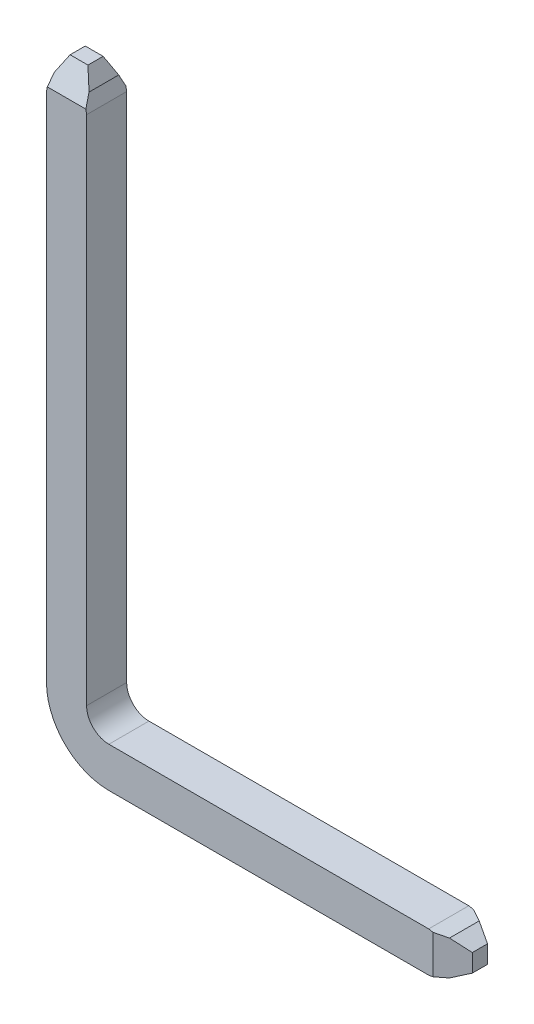
ISO-10303-21;
HEADER;
FILE_DESCRIPTION(('STEP AP214'),'2;1');
FILE_NAME('part.step','',(''),(''),'','','');
FILE_SCHEMA(('AUTOMOTIVE_DESIGN { 1 0 10303 214 1 1 1 1 }'));
ENDSEC;
DATA;
#1=APPLICATION_CONTEXT('core data for automotive mechanical design processes');
#2=APPLICATION_PROTOCOL_DEFINITION('international standard','automotive_design',2000,#1);
#3=PRODUCT_CONTEXT('',#1,'mechanical');
#4=PRODUCT('Part','Part','',(#3));
#5=PRODUCT_RELATED_PRODUCT_CATEGORY('part','',(#4));
#6=PRODUCT_DEFINITION_FORMATION('','',#4);
#7=PRODUCT_DEFINITION_CONTEXT('part definition',#1,'design');
#8=PRODUCT_DEFINITION('design','',#6,#7);
#9=PRODUCT_DEFINITION_SHAPE('','',#8);
#10=(LENGTH_UNIT() NAMED_UNIT(*) SI_UNIT(.MILLI.,.METRE.));
#11=(NAMED_UNIT(*) PLANE_ANGLE_UNIT() SI_UNIT($,.RADIAN.));
#12=(NAMED_UNIT(*) SI_UNIT($,.STERADIAN.) SOLID_ANGLE_UNIT());
#13=UNCERTAINTY_MEASURE_WITH_UNIT(LENGTH_MEASURE(1.E-05),#10,'distance_accuracy_value','');
#14=(GEOMETRIC_REPRESENTATION_CONTEXT(3) GLOBAL_UNCERTAINTY_ASSIGNED_CONTEXT((#13)) GLOBAL_UNIT_ASSIGNED_CONTEXT((#10,
#11,#12)) REPRESENTATION_CONTEXT('',''));
#15=CARTESIAN_POINT('',(0.,0.,0.));
#16=DIRECTION('',(0.,0.,1.));
#17=DIRECTION('',(1.,0.,0.));
#18=AXIS2_PLACEMENT_3D('',#15,#16,#17);
#19=CARTESIAN_POINT('',(11.2141,20.716822708758,0.5715));
#20=DIRECTION('',(-1.,0.,0.));
#21=DIRECTION('',(0.,0.,1.));
#22=AXIS2_PLACEMENT_3D('',#19,#20,#21);
#23=PLANE('',#22);
#24=DIRECTION('',(0.,1.,0.));
#25=VECTOR('',#24,1.);
#26=CARTESIAN_POINT('',(11.2141,16.6878,0.216173564485889));
#27=LINE('',#26,#25);
#28=CARTESIAN_POINT('',(11.2141,0.254384160478348,0.216173564485889));
#29=VERTEX_POINT('',#28);
#30=CARTESIAN_POINT('',(11.2141,-0.254384160478346,0.216173564485889));
#31=VERTEX_POINT('',#30);
#32=EDGE_CURVE('E280',#29,#31,#27,.F.);
#33=ORIENTED_EDGE('',*,*,#32,.T.);
#34=DIRECTION('',(0.,0.,1.));
#35=VECTOR('',#34,1.);
#36=CARTESIAN_POINT('',(11.2141,-0.254384160478346,-0.5715));
#37=LINE('',#36,#35);
#38=CARTESIAN_POINT('',(11.2141,-0.254384160478346,-0.216173564485888));
#39=VERTEX_POINT('',#38);
#40=EDGE_CURVE('E235',#31,#39,#37,.F.);
#41=ORIENTED_EDGE('',*,*,#40,.T.);
#42=DIRECTION('',(0.,1.,0.));
#43=VECTOR('',#42,1.);
#44=CARTESIAN_POINT('',(11.2141,16.6878,-0.216173564485889));
#45=LINE('',#44,#43);
#46=CARTESIAN_POINT('',(11.2141,0.254384160478346,-0.216173564485889));
#47=VERTEX_POINT('',#46);
#48=EDGE_CURVE('E223',#39,#47,#45,.T.);
#49=ORIENTED_EDGE('',*,*,#48,.T.);
#50=DIRECTION('',(0.,0.,1.));
#51=VECTOR('',#50,1.);
#52=CARTESIAN_POINT('',(11.2141,0.254384160478348,-0.5715));
#53=LINE('',#52,#51);
#54=EDGE_CURVE('E234',#47,#29,#53,.T.);
#55=ORIENTED_EDGE('',*,*,#54,.T.);
#56=EDGE_LOOP('',(#33,#41,#49,#55));
#57=FACE_BOUND('',#56,.T.);
#58=ADVANCED_FACE('F16',(#57),#23,.F.);
#59=CARTESIAN_POINT('',(10.7696,-0.493122657075091,-0.5715));
#60=DIRECTION('',(-0.473165915539229,0.880973334654303,0.));
#61=DIRECTION('',(-0.880973334654303,-0.473165915539229,0.));
#62=AXIS2_PLACEMENT_3D('',#59,#60,#61);
#63=PLANE('',#62);
#64=DIRECTION('',(-0.814891923823506,-0.437673954516203,0.379990344647562));
#65=VECTOR('',#64,1.);
#66=CARTESIAN_POINT('',(11.2141,-0.254384160478346,0.216173564485888));
#67=LINE('',#66,#65);
#68=CARTESIAN_POINT('',(10.7696,-0.493122657075091,0.423447318535787));
#69=VERTEX_POINT('',#68);
#70=EDGE_CURVE('E258',#31,#69,#67,.T.);
#71=ORIENTED_EDGE('',*,*,#70,.T.);
#72=DIRECTION('',(0.,0.,1.));
#73=VECTOR('',#72,1.);
#74=CARTESIAN_POINT('',(10.7696,-0.493122657075091,-0.5715));
#75=LINE('',#74,#73);
#76=CARTESIAN_POINT('',(10.7696,-0.493122657075091,-0.423447318535787));
#77=VERTEX_POINT('',#76);
#78=EDGE_CURVE('E197',#69,#77,#75,.F.);
#79=ORIENTED_EDGE('',*,*,#78,.T.);
#80=DIRECTION('',(0.814891923823506,0.437673954516204,0.379990344647562));
#81=VECTOR('',#80,1.);
#82=CARTESIAN_POINT('',(10.7696,-0.493122657075091,-0.423447318535787));
#83=LINE('',#82,#81);
#84=EDGE_CURVE('E255',#77,#39,#83,.T.);
#85=ORIENTED_EDGE('',*,*,#84,.T.);
#86=ORIENTED_EDGE('',*,*,#40,.F.);
#87=EDGE_LOOP('',(#71,#79,#85,#86));
#88=FACE_BOUND('',#87,.T.);
#89=ADVANCED_FACE('F546',(#88),#63,.F.);
#90=CARTESIAN_POINT('',(10.7696,0.493122657075091,-0.5715));
#91=DIRECTION('',(-0.473165915539229,-0.880973334654303,0.));
#92=DIRECTION('',(0.880973334654303,-0.473165915539229,0.));
#93=AXIS2_PLACEMENT_3D('',#90,#91,#92);
#94=PLANE('',#93);
#95=DIRECTION('',(0.814891923823508,-0.437673954516199,-0.379990344647563));
#96=VECTOR('',#95,1.);
#97=CARTESIAN_POINT('',(10.7696,0.493122657075091,0.423447318535787));
#98=LINE('',#97,#96);
#99=CARTESIAN_POINT('',(10.7696,0.493122657075091,0.423447318535787));
#100=VERTEX_POINT('',#99);
#101=EDGE_CURVE('E248',#100,#29,#98,.T.);
#102=ORIENTED_EDGE('',*,*,#101,.T.);
#103=ORIENTED_EDGE('',*,*,#54,.F.);
#104=DIRECTION('',(-0.814891923823506,0.437673954516204,-0.379990344647562));
#105=VECTOR('',#104,1.);
#106=CARTESIAN_POINT('',(11.2141,0.254384160478346,-0.216173564485889));
#107=LINE('',#106,#105);
#108=CARTESIAN_POINT('',(10.7696,0.493122657075091,-0.423447318535787));
#109=VERTEX_POINT('',#108);
#110=EDGE_CURVE('E210',#47,#109,#107,.T.);
#111=ORIENTED_EDGE('',*,*,#110,.T.);
#112=DIRECTION('',(0.,0.,1.));
#113=VECTOR('',#112,1.);
#114=CARTESIAN_POINT('',(10.7696,0.493122657075091,-0.5715));
#115=LINE('',#114,#113);
#116=EDGE_CURVE('E219',#109,#100,#115,.T.);
#117=ORIENTED_EDGE('',*,*,#116,.T.);
#118=EDGE_LOOP('',(#102,#103,#111,#117));
#119=FACE_BOUND('',#118,.T.);
#120=ADVANCED_FACE('F538',(#119),#94,.F.);
#121=CARTESIAN_POINT('',(11.2141,16.6878,0.216173564485889));
#122=DIRECTION('',(-0.422618261740701,0.,-0.906307787036649));
#123=DIRECTION('',(-0.906307787036649,0.,0.422618261740701));
#124=AXIS2_PLACEMENT_3D('',#121,#122,#123);
#125=PLANE('',#124);
#126=ORIENTED_EDGE('',*,*,#32,.F.);
#127=ORIENTED_EDGE('',*,*,#101,.F.);
#128=DIRECTION('',(-0.894952131932453,0.157804207302247,0.417323032802248));
#129=VECTOR('',#128,1.);
#130=CARTESIAN_POINT('',(10.7696,0.493122657075091,0.423447318535787));
#131=LINE('',#130,#129);
#132=CARTESIAN_POINT('',(10.4521,0.549106473450026,0.5715));
#133=VERTEX_POINT('',#132);
#134=EDGE_CURVE('E214',#100,#133,#131,.T.);
#135=ORIENTED_EDGE('',*,*,#134,.T.);
#136=DIRECTION('',(0.,1.,0.));
#137=VECTOR('',#136,1.);
#138=CARTESIAN_POINT('',(10.4521,16.6878,0.5715));
#139=LINE('',#138,#137);
#140=CARTESIAN_POINT('',(10.4521,-0.549106473450026,0.5715));
#141=VERTEX_POINT('',#140);
#142=EDGE_CURVE('E245',#141,#133,#139,.T.);
#143=ORIENTED_EDGE('',*,*,#142,.F.);
#144=DIRECTION('',(0.894952131932454,0.157804207302247,-0.417323032802247));
#145=VECTOR('',#144,1.);
#146=CARTESIAN_POINT('',(10.4521,-0.549106473450026,0.5715));
#147=LINE('',#146,#145);
#148=EDGE_CURVE('E239',#141,#69,#147,.T.);
#149=ORIENTED_EDGE('',*,*,#148,.T.);
#150=ORIENTED_EDGE('',*,*,#70,.F.);
#151=EDGE_LOOP('',(#126,#127,#135,#143,#149,#150));
#152=FACE_BOUND('',#151,.T.);
#153=ADVANCED_FACE('F531',(#152),#125,.F.);
#154=CARTESIAN_POINT('',(11.2141,16.6878,-0.216173564485889));
#155=DIRECTION('',(-0.422618261740701,0.,0.906307787036649));
#156=DIRECTION('',(0.906307787036649,0.,0.422618261740701));
#157=AXIS2_PLACEMENT_3D('',#154,#155,#156);
#158=PLANE('',#157);
#159=DIRECTION('',(0.894952131932453,-0.157804207302247,0.417323032802248));
#160=VECTOR('',#159,1.);
#161=CARTESIAN_POINT('',(10.4521,0.549106473450026,-0.5715));
#162=LINE('',#161,#160);
#163=CARTESIAN_POINT('',(10.4521,0.549106473450026,-0.5715));
#164=VERTEX_POINT('',#163);
#165=EDGE_CURVE('E191',#164,#109,#162,.T.);
#166=ORIENTED_EDGE('',*,*,#165,.T.);
#167=ORIENTED_EDGE('',*,*,#110,.F.);
#168=ORIENTED_EDGE('',*,*,#48,.F.);
#169=ORIENTED_EDGE('',*,*,#84,.F.);
#170=DIRECTION('',(-0.894952131932453,-0.157804207302247,-0.417323032802249));
#171=VECTOR('',#170,1.);
#172=CARTESIAN_POINT('',(10.7696,-0.493122657075091,-0.423447318535787));
#173=LINE('',#172,#171);
#174=CARTESIAN_POINT('',(10.4521,-0.549106473450029,-0.5715));
#175=VERTEX_POINT('',#174);
#176=EDGE_CURVE('E207',#77,#175,#173,.T.);
#177=ORIENTED_EDGE('',*,*,#176,.T.);
#178=DIRECTION('',(0.,1.,0.));
#179=VECTOR('',#178,1.);
#180=CARTESIAN_POINT('',(10.4521,20.716822708758,-0.5715));
#181=LINE('',#180,#179);
#182=EDGE_CURVE('E204',#164,#175,#181,.F.);
#183=ORIENTED_EDGE('',*,*,#182,.F.);
#184=EDGE_LOOP('',(#166,#167,#168,#169,#177,#183));
#185=FACE_BOUND('',#184,.T.);
#186=ADVANCED_FACE('F377',(#185),#158,.F.);
#187=CARTESIAN_POINT('',(10.3251,-0.5715,-0.5715));
#188=DIRECTION('',(-0.173648177666924,0.984807753012209,0.));
#189=DIRECTION('',(-0.984807753012209,-0.173648177666924,0.));
#190=AXIS2_PLACEMENT_3D('',#187,#188,#189);
#191=PLANE('',#190);
#192=ORIENTED_EDGE('',*,*,#148,.F.);
#193=DIRECTION('',(-0.984807753012209,-0.173648177666924,0.));
#194=VECTOR('',#193,1.);
#195=CARTESIAN_POINT('',(10.3251,-0.5715,0.5715));
#196=LINE('',#195,#194);
#197=CARTESIAN_POINT('',(10.3251,-0.5715,0.5715));
#198=VERTEX_POINT('',#197);
#199=EDGE_CURVE('E209',#198,#141,#196,.F.);
#200=ORIENTED_EDGE('',*,*,#199,.F.);
#201=DIRECTION('',(0.,0.,1.));
#202=VECTOR('',#201,1.);
#203=CARTESIAN_POINT('',(10.3251,-0.5715,0.5715));
#204=LINE('',#203,#202);
#205=CARTESIAN_POINT('',(10.3251,-0.5715,-0.5715));
#206=VERTEX_POINT('',#205);
#207=EDGE_CURVE('E162',#198,#206,#204,.F.);
#208=ORIENTED_EDGE('',*,*,#207,.T.);
#209=DIRECTION('',(-0.984807753012215,-0.173648177666889,0.));
#210=VECTOR('',#209,1.);
#211=CARTESIAN_POINT('',(10.4521,-0.54910647345003,-0.5715));
#212=LINE('',#211,#210);
#213=EDGE_CURVE('E201',#175,#206,#212,.T.);
#214=ORIENTED_EDGE('',*,*,#213,.F.);
#215=ORIENTED_EDGE('',*,*,#176,.F.);
#216=ORIENTED_EDGE('',*,*,#78,.F.);
#217=EDGE_LOOP('',(#192,#200,#208,#214,#215,#216));
#218=FACE_BOUND('',#217,.T.);
#219=ADVANCED_FACE('F384',(#218),#191,.F.);
#220=CARTESIAN_POINT('',(0.,-0.5715,0.5715));
#221=DIRECTION('',(0.,1.,0.));
#222=DIRECTION('',(0.,0.,1.));
#223=AXIS2_PLACEMENT_3D('',#220,#221,#222);
#224=PLANE('',#223);
#225=ORIENTED_EDGE('',*,*,#207,.F.);
#226=DIRECTION('',(1.,0.,0.));
#227=VECTOR('',#226,1.);
#228=CARTESIAN_POINT('',(0.,-0.5715,0.5715));
#229=LINE('',#228,#227);
#230=CARTESIAN_POINT('',(1.2065,-0.5715,0.5715));
#231=VERTEX_POINT('',#230);
#232=EDGE_CURVE('E196',#231,#198,#229,.T.);
#233=ORIENTED_EDGE('',*,*,#232,.F.);
#234=DIRECTION('',(0.,0.,1.));
#235=VECTOR('',#234,1.);
#236=CARTESIAN_POINT('',(1.2065,-0.5715,0.5715));
#237=LINE('',#236,#235);
#238=CARTESIAN_POINT('',(1.2065,-0.5715,-0.571499999999999));
#239=VERTEX_POINT('',#238);
#240=EDGE_CURVE('E194',#239,#231,#237,.T.);
#241=ORIENTED_EDGE('',*,*,#240,.F.);
#242=DIRECTION('',(-1.,0.,0.));
#243=VECTOR('',#242,1.);
#244=CARTESIAN_POINT('',(0.,-0.571499999999999,-0.5715));
#245=LINE('',#244,#243);
#246=EDGE_CURVE('E173',#206,#239,#245,.T.);
#247=ORIENTED_EDGE('',*,*,#246,.F.);
#248=EDGE_LOOP('',(#225,#233,#241,#247));
#249=FACE_BOUND('',#248,.T.);
#250=ADVANCED_FACE('F389',(#249),#224,.F.);
#251=CARTESIAN_POINT('',(0.,0.5715,0.5715));
#252=DIRECTION('',(0.,1.,0.));
#253=DIRECTION('',(0.,0.,1.));
#254=AXIS2_PLACEMENT_3D('',#251,#252,#253);
#255=PLANE('',#254);
#256=DIRECTION('',(0.,0.,1.));
#257=VECTOR('',#256,1.);
#258=CARTESIAN_POINT('',(1.2065,0.5715,0.5715));
#259=LINE('',#258,#257);
#260=CARTESIAN_POINT('',(1.2065,0.571499999999999,-0.5715));
#261=VERTEX_POINT('',#260);
#262=CARTESIAN_POINT('',(1.2065,0.5715,0.5715));
#263=VERTEX_POINT('',#262);
#264=EDGE_CURVE('E154',#261,#263,#259,.T.);
#265=ORIENTED_EDGE('',*,*,#264,.T.);
#266=DIRECTION('',(1.,0.,0.));
#267=VECTOR('',#266,1.);
#268=CARTESIAN_POINT('',(0.,0.5715,0.571499999999999));
#269=LINE('',#268,#267);
#270=CARTESIAN_POINT('',(10.3251,0.5715,0.5715));
#271=VERTEX_POINT('',#270);
#272=EDGE_CURVE('E161',#263,#271,#269,.T.);
#273=ORIENTED_EDGE('',*,*,#272,.T.);
#274=DIRECTION('',(0.,0.,1.));
#275=VECTOR('',#274,1.);
#276=CARTESIAN_POINT('',(10.3251,0.5715,-0.5715));
#277=LINE('',#276,#275);
#278=CARTESIAN_POINT('',(10.3251,0.5715,-0.5715));
#279=VERTEX_POINT('',#278);
#280=EDGE_CURVE('E168',#271,#279,#277,.F.);
#281=ORIENTED_EDGE('',*,*,#280,.T.);
#282=DIRECTION('',(-1.,0.,0.));
#283=VECTOR('',#282,1.);
#284=CARTESIAN_POINT('',(0.,0.571499999999999,-0.5715));
#285=LINE('',#284,#283);
#286=EDGE_CURVE('E165',#261,#279,#285,.F.);
#287=ORIENTED_EDGE('',*,*,#286,.F.);
#288=EDGE_LOOP('',(#265,#273,#281,#287));
#289=FACE_BOUND('',#288,.T.);
#290=ADVANCED_FACE('F166',(#289),#255,.T.);
#291=CARTESIAN_POINT('',(10.3251,0.5715,-0.5715));
#292=DIRECTION('',(-0.173648177666924,-0.984807753012209,0.));
#293=DIRECTION('',(0.984807753012209,-0.173648177666924,0.));
#294=AXIS2_PLACEMENT_3D('',#291,#292,#293);
#295=PLANE('',#294);
#296=ORIENTED_EDGE('',*,*,#134,.F.);
#297=ORIENTED_EDGE('',*,*,#116,.F.);
#298=ORIENTED_EDGE('',*,*,#165,.F.);
#299=DIRECTION('',(0.984807753012211,-0.173648177666915,0.));
#300=VECTOR('',#299,1.);
#301=CARTESIAN_POINT('',(10.3251,0.571499999999999,-0.5715));
#302=LINE('',#301,#300);
#303=EDGE_CURVE('E172',#279,#164,#302,.T.);
#304=ORIENTED_EDGE('',*,*,#303,.F.);
#305=ORIENTED_EDGE('',*,*,#280,.F.);
#306=DIRECTION('',(0.984807753012211,-0.173648177666915,0.));
#307=VECTOR('',#306,1.);
#308=CARTESIAN_POINT('',(10.3251,0.571499999999999,0.5715));
#309=LINE('',#308,#307);
#310=EDGE_CURVE('E232',#271,#133,#309,.T.);
#311=ORIENTED_EDGE('',*,*,#310,.T.);
#312=EDGE_LOOP('',(#296,#297,#298,#304,#305,#311));
#313=FACE_BOUND('',#312,.T.);
#314=ADVANCED_FACE('F372',(#313),#295,.F.);
#315=CARTESIAN_POINT('',(1.2065,1.2065,-28.0032326467246));
#316=DIRECTION('',(0.,0.,1.));
#317=DIRECTION('',(1.,0.,0.));
#318=AXIS2_PLACEMENT_3D('',#315,#316,#317);
#319=CYLINDRICAL_SURFACE('',#318,1.778);
#320=CARTESIAN_POINT('',(1.2065,1.2065,0.571499999999999));
#321=DIRECTION('',(0.,0.,1.));
#322=DIRECTION('',(1.,0.,0.));
#323=AXIS2_PLACEMENT_3D('',#320,#321,#322);
#324=CIRCLE('',#323,1.778);
#325=CARTESIAN_POINT('',(-0.571500000000001,1.2065,0.5715));
#326=VERTEX_POINT('',#325);
#327=EDGE_CURVE('E292',#326,#231,#324,.T.);
#328=ORIENTED_EDGE('',*,*,#327,.F.);
#329=DIRECTION('',(0.,0.,1.));
#330=VECTOR('',#329,1.);
#331=CARTESIAN_POINT('',(-0.5715,1.2065,-28.0032326467246));
#332=LINE('',#331,#330);
#333=CARTESIAN_POINT('',(-0.571500000000001,1.2065,-0.571499999999999));
#334=VERTEX_POINT('',#333);
#335=EDGE_CURVE('E183',#326,#334,#332,.F.);
#336=ORIENTED_EDGE('',*,*,#335,.T.);
#337=CARTESIAN_POINT('',(1.2065,1.2065,-0.571499999999999));
#338=DIRECTION('',(0.,0.,1.));
#339=DIRECTION('',(1.,0.,0.));
#340=AXIS2_PLACEMENT_3D('',#337,#338,#339);
#341=CIRCLE('',#340,1.778);
#342=EDGE_CURVE('E181',#334,#239,#341,.T.);
#343=ORIENTED_EDGE('',*,*,#342,.T.);
#344=ORIENTED_EDGE('',*,*,#240,.T.);
#345=EDGE_LOOP('',(#328,#336,#343,#344));
#346=FACE_BOUND('',#345,.T.);
#347=ADVANCED_FACE('F390',(#346),#319,.T.);
#348=CARTESIAN_POINT('',(31.6183741544137,16.6878,0.5715));
#349=DIRECTION('',(0.,1.,0.));
#350=DIRECTION('',(-1.,0.,0.));
#351=AXIS2_PLACEMENT_3D('',#348,#349,#350);
#352=PLANE('',#351);
#353=DIRECTION('',(1.,0.,0.));
#354=VECTOR('',#353,1.);
#355=CARTESIAN_POINT('',(8.06450000000001,16.6878,0.216173564485891));
#356=LINE('',#355,#354);
#357=CARTESIAN_POINT('',(-0.254384160478348,16.6878,0.216173564485891));
#358=VERTEX_POINT('',#357);
#359=CARTESIAN_POINT('',(0.254384160478348,16.6878,0.216173564485891));
#360=VERTEX_POINT('',#359);
#361=EDGE_CURVE('E360',#358,#360,#356,.T.);
#362=ORIENTED_EDGE('',*,*,#361,.T.);
#363=DIRECTION('',(0.,0.,1.));
#364=VECTOR('',#363,1.);
#365=CARTESIAN_POINT('',(0.254384160478348,16.6878,-0.5715));
#366=LINE('',#365,#364);
#367=CARTESIAN_POINT('',(0.254384160478348,16.6878,-0.216173564485892));
#368=VERTEX_POINT('',#367);
#369=EDGE_CURVE('E291',#360,#368,#366,.F.);
#370=ORIENTED_EDGE('',*,*,#369,.T.);
#371=DIRECTION('',(1.,0.,0.));
#372=VECTOR('',#371,1.);
#373=CARTESIAN_POINT('',(8.06450000000001,16.6878,-0.216173564485892));
#374=LINE('',#373,#372);
#375=CARTESIAN_POINT('',(-0.254384160478349,16.6878,-0.216173564485892));
#376=VERTEX_POINT('',#375);
#377=EDGE_CURVE('E342',#368,#376,#374,.F.);
#378=ORIENTED_EDGE('',*,*,#377,.T.);
#379=DIRECTION('',(0.,0.,1.));
#380=VECTOR('',#379,1.);
#381=CARTESIAN_POINT('',(-0.254384160478349,16.6878,-0.5715));
#382=LINE('',#381,#380);
#383=EDGE_CURVE('E350',#376,#358,#382,.T.);
#384=ORIENTED_EDGE('',*,*,#383,.T.);
#385=EDGE_LOOP('',(#362,#370,#378,#384));
#386=FACE_BOUND('',#385,.T.);
#387=ADVANCED_FACE('F414',(#386),#352,.T.);
#388=CARTESIAN_POINT('',(0.49312265707509,16.2433,-0.5715));
#389=DIRECTION('',(-0.880973334654304,-0.473165915539228,0.));
#390=DIRECTION('',(0.473165915539228,-0.880973334654304,0.));
#391=AXIS2_PLACEMENT_3D('',#388,#389,#390);
#392=PLANE('',#391);
#393=DIRECTION('',(-0.437673954516202,0.814891923823507,0.379990344647562));
#394=VECTOR('',#393,1.);
#395=CARTESIAN_POINT('',(0.49312265707509,16.2433,-0.42344731853579));
#396=LINE('',#395,#394);
#397=CARTESIAN_POINT('',(0.49312265707509,16.2433,-0.423447318535789));
#398=VERTEX_POINT('',#397);
#399=EDGE_CURVE('E345',#398,#368,#396,.T.);
#400=ORIENTED_EDGE('',*,*,#399,.T.);
#401=ORIENTED_EDGE('',*,*,#369,.F.);
#402=DIRECTION('',(0.437673954516199,-0.814891923823508,0.379990344647562));
#403=VECTOR('',#402,1.);
#404=CARTESIAN_POINT('',(0.254384160478347,16.6878,0.216173564485891));
#405=LINE('',#404,#403);
#406=CARTESIAN_POINT('',(0.493122657075089,16.2433,0.423447318535788));
#407=VERTEX_POINT('',#406);
#408=EDGE_CURVE('E358',#360,#407,#405,.T.);
#409=ORIENTED_EDGE('',*,*,#408,.T.);
#410=DIRECTION('',(0.,0.,1.));
#411=VECTOR('',#410,1.);
#412=CARTESIAN_POINT('',(0.49312265707509,16.2433,-0.5715));
#413=LINE('',#412,#411);
#414=EDGE_CURVE('E335',#407,#398,#413,.F.);
#415=ORIENTED_EDGE('',*,*,#414,.T.);
#416=EDGE_LOOP('',(#400,#401,#409,#415));
#417=FACE_BOUND('',#416,.T.);
#418=ADVANCED_FACE('F417',(#417),#392,.F.);
#419=CARTESIAN_POINT('',(1.2065,1.2065,-28.0032326467246));
#420=DIRECTION('',(0.,0.,1.));
#421=DIRECTION('',(1.,0.,0.));
#422=AXIS2_PLACEMENT_3D('',#419,#420,#421);
#423=CYLINDRICAL_SURFACE('',#422,0.635);
#424=DIRECTION('',(0.,0.,1.));
#425=VECTOR('',#424,1.);
#426=CARTESIAN_POINT('',(0.5715,1.2065,0.5715));
#427=LINE('',#426,#425);
#428=CARTESIAN_POINT('',(0.5715,1.2065,0.5715));
#429=VERTEX_POINT('',#428);
#430=CARTESIAN_POINT('',(0.5715,1.2065,-0.571499999999999));
#431=VERTEX_POINT('',#430);
#432=EDGE_CURVE('E363',#429,#431,#427,.F.);
#433=ORIENTED_EDGE('',*,*,#432,.F.);
#434=CARTESIAN_POINT('',(1.2065,1.2065,0.571499999999999));
#435=DIRECTION('',(0.,0.,1.));
#436=DIRECTION('',(1.,0.,0.));
#437=AXIS2_PLACEMENT_3D('',#434,#435,#436);
#438=CIRCLE('',#437,0.635);
#439=EDGE_CURVE('E157',#263,#429,#438,.F.);
#440=ORIENTED_EDGE('',*,*,#439,.F.);
#441=ORIENTED_EDGE('',*,*,#264,.F.);
#442=CARTESIAN_POINT('',(1.2065,1.2065,-0.571499999999999));
#443=DIRECTION('',(0.,0.,1.));
#444=DIRECTION('',(1.,0.,0.));
#445=AXIS2_PLACEMENT_3D('',#442,#443,#444);
#446=CIRCLE('',#445,0.635);
#447=EDGE_CURVE('E19',#431,#261,#446,.T.);
#448=ORIENTED_EDGE('',*,*,#447,.F.);
#449=EDGE_LOOP('',(#433,#440,#441,#448));
#450=FACE_BOUND('',#449,.T.);
#451=ADVANCED_FACE('F156',(#450),#423,.F.);
#452=CARTESIAN_POINT('',(31.6183741544137,16.6878,0.5715));
#453=DIRECTION('',(0.,0.,-1.));
#454=DIRECTION('',(-1.,0.,0.));
#455=AXIS2_PLACEMENT_3D('',#452,#453,#454);
#456=PLANE('',#455);
#457=DIRECTION('',(1.,0.,0.));
#458=VECTOR('',#457,1.);
#459=CARTESIAN_POINT('',(8.06450000000001,15.9258,0.5715));
#460=LINE('',#459,#458);
#461=CARTESIAN_POINT('',(0.549106473450026,15.9258,0.5715));
#462=VERTEX_POINT('',#461);
#463=CARTESIAN_POINT('',(-0.549106473450024,15.9258,0.5715));
#464=VERTEX_POINT('',#463);
#465=EDGE_CURVE('E355',#462,#464,#460,.F.);
#466=ORIENTED_EDGE('',*,*,#465,.T.);
#467=DIRECTION('',(0.173648177666963,0.984807753012202,0.));
#468=VECTOR('',#467,1.);
#469=CARTESIAN_POINT('',(-0.571500000000003,15.7988,0.5715));
#470=LINE('',#469,#468);
#471=CARTESIAN_POINT('',(-0.571500000000001,15.7988,0.5715));
#472=VERTEX_POINT('',#471);
#473=EDGE_CURVE('E290',#472,#464,#470,.T.);
#474=ORIENTED_EDGE('',*,*,#473,.F.);
#475=DIRECTION('',(0.,1.,0.));
#476=VECTOR('',#475,1.);
#477=CARTESIAN_POINT('',(-0.571500000000001,16.6878,0.5715));
#478=LINE('',#477,#476);
#479=EDGE_CURVE('E304',#472,#326,#478,.F.);
#480=ORIENTED_EDGE('',*,*,#479,.T.);
#481=ORIENTED_EDGE('',*,*,#327,.T.);
#482=ORIENTED_EDGE('',*,*,#232,.T.);
#483=ORIENTED_EDGE('',*,*,#199,.T.);
#484=ORIENTED_EDGE('',*,*,#142,.T.);
#485=ORIENTED_EDGE('',*,*,#310,.F.);
#486=ORIENTED_EDGE('',*,*,#272,.F.);
#487=ORIENTED_EDGE('',*,*,#439,.T.);
#488=DIRECTION('',(0.,1.,0.));
#489=VECTOR('',#488,1.);
#490=CARTESIAN_POINT('',(0.571499999999999,16.6878,0.5715));
#491=LINE('',#490,#489);
#492=CARTESIAN_POINT('',(0.571499999999999,15.7988,0.5715));
#493=VERTEX_POINT('',#492);
#494=EDGE_CURVE('E332',#493,#429,#491,.F.);
#495=ORIENTED_EDGE('',*,*,#494,.F.);
#496=DIRECTION('',(0.173648177666924,-0.984807753012209,0.));
#497=VECTOR('',#496,1.);
#498=CARTESIAN_POINT('',(0.571499999999999,15.7988,0.5715));
#499=LINE('',#498,#497);
#500=EDGE_CURVE('E340',#493,#462,#499,.F.);
#501=ORIENTED_EDGE('',*,*,#500,.T.);
#502=EDGE_LOOP('',(#466,#474,#480,#481,#482,#483,#484,#485,#486,#487,#495,#501));
#503=FACE_BOUND('',#502,.T.);
#504=ADVANCED_FACE('F368',(#503),#456,.F.);
#505=CARTESIAN_POINT('',(8.06450000000001,16.6878,0.216173564485891));
#506=DIRECTION('',(0.,-0.4226182617407,-0.90630778703665));
#507=DIRECTION('',(0.,0.90630778703665,-0.4226182617407));
#508=AXIS2_PLACEMENT_3D('',#505,#506,#507);
#509=PLANE('',#508);
#510=ORIENTED_EDGE('',*,*,#465,.F.);
#511=DIRECTION('',(-0.157804207302247,0.894952131932453,-0.417323032802249));
#512=VECTOR('',#511,1.);
#513=CARTESIAN_POINT('',(0.549106473450025,15.9258,0.5715));
#514=LINE('',#513,#512);
#515=EDGE_CURVE('E337',#462,#407,#514,.T.);
#516=ORIENTED_EDGE('',*,*,#515,.T.);
#517=ORIENTED_EDGE('',*,*,#408,.F.);
#518=ORIENTED_EDGE('',*,*,#361,.F.);
#519=DIRECTION('',(-0.4376739545162,-0.814891923823509,0.379990344647561));
#520=VECTOR('',#519,1.);
#521=CARTESIAN_POINT('',(-0.254384160478349,16.6878,0.216173564485891));
#522=LINE('',#521,#520);
#523=CARTESIAN_POINT('',(-0.493122657075091,16.2433,0.423447318535788));
#524=VERTEX_POINT('',#523);
#525=EDGE_CURVE('E353',#358,#524,#522,.T.);
#526=ORIENTED_EDGE('',*,*,#525,.T.);
#527=DIRECTION('',(-0.157804207302246,-0.894952131932453,0.417323032802249));
#528=VECTOR('',#527,1.);
#529=CARTESIAN_POINT('',(-0.493122657075091,16.2433,0.423447318535788));
#530=LINE('',#529,#528);
#531=EDGE_CURVE('E326',#524,#464,#530,.T.);
#532=ORIENTED_EDGE('',*,*,#531,.T.);
#533=EDGE_LOOP('',(#510,#516,#517,#518,#526,#532));
#534=FACE_BOUND('',#533,.T.);
#535=ADVANCED_FACE('F409',(#534),#509,.F.);
#536=CARTESIAN_POINT('',(-0.493122657075091,16.2433,-0.5715));
#537=DIRECTION('',(0.880973334654304,-0.473165915539228,0.));
#538=DIRECTION('',(0.473165915539228,0.880973334654304,0.));
#539=AXIS2_PLACEMENT_3D('',#536,#537,#538);
#540=PLANE('',#539);
#541=DIRECTION('',(-0.437673954516202,-0.814891923823507,-0.379990344647562));
#542=VECTOR('',#541,1.);
#543=CARTESIAN_POINT('',(-0.254384160478347,16.6878,-0.216173564485892));
#544=LINE('',#543,#542);
#545=CARTESIAN_POINT('',(-0.493122657075091,16.2433,-0.423447318535789));
#546=VERTEX_POINT('',#545);
#547=EDGE_CURVE('E348',#376,#546,#544,.T.);
#548=ORIENTED_EDGE('',*,*,#547,.T.);
#549=DIRECTION('',(0.,0.,1.));
#550=VECTOR('',#549,1.);
#551=CARTESIAN_POINT('',(-0.493122657075091,16.2433,-0.5715));
#552=LINE('',#551,#550);
#553=EDGE_CURVE('E317',#546,#524,#552,.T.);
#554=ORIENTED_EDGE('',*,*,#553,.T.);
#555=ORIENTED_EDGE('',*,*,#525,.F.);
#556=ORIENTED_EDGE('',*,*,#383,.F.);
#557=EDGE_LOOP('',(#548,#554,#555,#556));
#558=FACE_BOUND('',#557,.T.);
#559=ADVANCED_FACE('F412',(#558),#540,.F.);
#560=CARTESIAN_POINT('',(8.06450000000001,16.6878,-0.216173564485892));
#561=DIRECTION('',(0.,-0.4226182617407,0.90630778703665));
#562=DIRECTION('',(0.,-0.90630778703665,-0.4226182617407));
#563=AXIS2_PLACEMENT_3D('',#560,#561,#562);
#564=PLANE('',#563);
#565=ORIENTED_EDGE('',*,*,#399,.F.);
#566=DIRECTION('',(0.157804207302247,-0.894952131932453,-0.417323032802248));
#567=VECTOR('',#566,1.);
#568=CARTESIAN_POINT('',(0.49312265707509,16.2433,-0.423447318535789));
#569=LINE('',#568,#567);
#570=CARTESIAN_POINT('',(0.549106473450025,15.9258,-0.571500000000001));
#571=VERTEX_POINT('',#570);
#572=EDGE_CURVE('E333',#398,#571,#569,.T.);
#573=ORIENTED_EDGE('',*,*,#572,.T.);
#574=DIRECTION('',(-1.,0.,0.));
#575=VECTOR('',#574,1.);
#576=CARTESIAN_POINT('',(31.6183741544137,15.9258,-0.5715));
#577=LINE('',#576,#575);
#578=CARTESIAN_POINT('',(-0.549106473450024,15.9258,-0.5715));
#579=VERTEX_POINT('',#578);
#580=EDGE_CURVE('E313',#579,#571,#577,.F.);
#581=ORIENTED_EDGE('',*,*,#580,.F.);
#582=DIRECTION('',(0.157804207302246,0.894952131932452,0.41732303280225));
#583=VECTOR('',#582,1.);
#584=CARTESIAN_POINT('',(-0.549106473450026,15.9258,-0.571500000000001));
#585=LINE('',#584,#583);
#586=EDGE_CURVE('E322',#579,#546,#585,.T.);
#587=ORIENTED_EDGE('',*,*,#586,.T.);
#588=ORIENTED_EDGE('',*,*,#547,.F.);
#589=ORIENTED_EDGE('',*,*,#377,.F.);
#590=EDGE_LOOP('',(#565,#573,#581,#587,#588,#589));
#591=FACE_BOUND('',#590,.T.);
#592=ADVANCED_FACE('F399',(#591),#564,.F.);
#593=CARTESIAN_POINT('',(0.571499999999999,15.7988,-0.5715));
#594=DIRECTION('',(-0.984807753012209,-0.173648177666924,0.));
#595=DIRECTION('',(0.173648177666924,-0.984807753012209,0.));
#596=AXIS2_PLACEMENT_3D('',#593,#594,#595);
#597=PLANE('',#596);
#598=ORIENTED_EDGE('',*,*,#572,.F.);
#599=ORIENTED_EDGE('',*,*,#414,.F.);
#600=ORIENTED_EDGE('',*,*,#515,.F.);
#601=ORIENTED_EDGE('',*,*,#500,.F.);
#602=DIRECTION('',(0.,0.,1.));
#603=VECTOR('',#602,1.);
#604=CARTESIAN_POINT('',(0.571499999999999,15.7988,0.5715));
#605=LINE('',#604,#603);
#606=CARTESIAN_POINT('',(0.571499999999999,15.7988,-0.5715));
#607=VERTEX_POINT('',#606);
#608=EDGE_CURVE('E329',#607,#493,#605,.T.);
#609=ORIENTED_EDGE('',*,*,#608,.F.);
#610=DIRECTION('',(0.173648177666911,-0.984807753012212,0.));
#611=VECTOR('',#610,1.);
#612=CARTESIAN_POINT('',(0.549106473450026,15.9258,-0.5715));
#613=LINE('',#612,#611);
#614=EDGE_CURVE('E312',#571,#607,#613,.T.);
#615=ORIENTED_EDGE('',*,*,#614,.F.);
#616=EDGE_LOOP('',(#598,#599,#600,#601,#609,#615));
#617=FACE_BOUND('',#616,.T.);
#618=ADVANCED_FACE('F405',(#617),#597,.F.);
#619=CARTESIAN_POINT('',(0.571499999999999,16.6878,0.5715));
#620=DIRECTION('',(1.,0.,0.));
#621=DIRECTION('',(0.,1.,0.));
#622=AXIS2_PLACEMENT_3D('',#619,#620,#621);
#623=PLANE('',#622);
#624=ORIENTED_EDGE('',*,*,#432,.T.);
#625=DIRECTION('',(0.,1.,0.));
#626=VECTOR('',#625,1.);
#627=CARTESIAN_POINT('',(0.571499999999999,16.6878,-0.5715));
#628=LINE('',#627,#626);
#629=EDGE_CURVE('E179',#607,#431,#628,.F.);
#630=ORIENTED_EDGE('',*,*,#629,.F.);
#631=ORIENTED_EDGE('',*,*,#608,.T.);
#632=ORIENTED_EDGE('',*,*,#494,.T.);
#633=EDGE_LOOP('',(#624,#630,#631,#632));
#634=FACE_BOUND('',#633,.T.);
#635=ADVANCED_FACE('F367',(#634),#623,.T.);
#636=CARTESIAN_POINT('',(-0.571500000000001,16.6878,0.5715));
#637=DIRECTION('',(1.,0.,0.));
#638=DIRECTION('',(0.,1.,0.));
#639=AXIS2_PLACEMENT_3D('',#636,#637,#638);
#640=PLANE('',#639);
#641=DIRECTION('',(0.,0.,1.));
#642=VECTOR('',#641,1.);
#643=CARTESIAN_POINT('',(-0.5715,15.7988,-0.5715));
#644=LINE('',#643,#642);
#645=CARTESIAN_POINT('',(-0.571500000000001,15.7988,-0.5715));
#646=VERTEX_POINT('',#645);
#647=EDGE_CURVE('E34',#472,#646,#644,.F.);
#648=ORIENTED_EDGE('',*,*,#647,.T.);
#649=DIRECTION('',(0.,1.,0.));
#650=VECTOR('',#649,1.);
#651=CARTESIAN_POINT('',(-0.571500000000003,16.6878,-0.5715));
#652=LINE('',#651,#650);
#653=EDGE_CURVE('E25',#334,#646,#652,.T.);
#654=ORIENTED_EDGE('',*,*,#653,.F.);
#655=ORIENTED_EDGE('',*,*,#335,.F.);
#656=ORIENTED_EDGE('',*,*,#479,.F.);
#657=EDGE_LOOP('',(#648,#654,#655,#656));
#658=FACE_BOUND('',#657,.T.);
#659=ADVANCED_FACE('F391',(#658),#640,.F.);
#660=CARTESIAN_POINT('',(-0.5715,15.7988,-0.5715));
#661=DIRECTION('',(0.984807753012209,-0.173648177666923,0.));
#662=DIRECTION('',(0.173648177666923,0.984807753012209,0.));
#663=AXIS2_PLACEMENT_3D('',#660,#661,#662);
#664=PLANE('',#663);
#665=ORIENTED_EDGE('',*,*,#586,.F.);
#666=DIRECTION('',(0.173648177666963,0.984807753012202,0.));
#667=VECTOR('',#666,1.);
#668=CARTESIAN_POINT('',(-0.571500000000003,15.7988,-0.5715));
#669=LINE('',#668,#667);
#670=EDGE_CURVE('E11',#646,#579,#669,.T.);
#671=ORIENTED_EDGE('',*,*,#670,.F.);
#672=ORIENTED_EDGE('',*,*,#647,.F.);
#673=ORIENTED_EDGE('',*,*,#473,.T.);
#674=ORIENTED_EDGE('',*,*,#531,.F.);
#675=ORIENTED_EDGE('',*,*,#553,.F.);
#676=EDGE_LOOP('',(#665,#671,#672,#673,#674,#675));
#677=FACE_BOUND('',#676,.T.);
#678=ADVANCED_FACE('F394',(#677),#664,.F.);
#679=CARTESIAN_POINT('',(31.6183741544137,16.6878,-0.5715));
#680=DIRECTION('',(0.,0.,-1.));
#681=DIRECTION('',(-1.,0.,0.));
#682=AXIS2_PLACEMENT_3D('',#679,#680,#681);
#683=PLANE('',#682);
#684=ORIENTED_EDGE('',*,*,#653,.T.);
#685=ORIENTED_EDGE('',*,*,#670,.T.);
#686=ORIENTED_EDGE('',*,*,#580,.T.);
#687=ORIENTED_EDGE('',*,*,#614,.T.);
#688=ORIENTED_EDGE('',*,*,#629,.T.);
#689=ORIENTED_EDGE('',*,*,#447,.T.);
#690=ORIENTED_EDGE('',*,*,#286,.T.);
#691=ORIENTED_EDGE('',*,*,#303,.T.);
#692=ORIENTED_EDGE('',*,*,#182,.T.);
#693=ORIENTED_EDGE('',*,*,#213,.T.);
#694=ORIENTED_EDGE('',*,*,#246,.T.);
#695=ORIENTED_EDGE('',*,*,#342,.F.);
#696=EDGE_LOOP('',(#684,#685,#686,#687,#688,#689,#690,#691,#692,#693,#694,#695));
#697=FACE_BOUND('',#696,.T.);
#698=ADVANCED_FACE('F176',(#697),#683,.T.);
#699=CLOSED_SHELL('',(#58,#89,#120,#153,#186,#219,#250,#290,#314,#347,#387,#418,#451,#504,#535,
#559,#592,#618,#635,#659,#678,#698));
#700=MANIFOLD_SOLID_BREP('B1',#699);
#701=ADVANCED_BREP_SHAPE_REPRESENTATION('',(#18,#700),#14);
#702=SHAPE_DEFINITION_REPRESENTATION(#9,#701);
ENDSEC;
END-ISO-10303-21;
